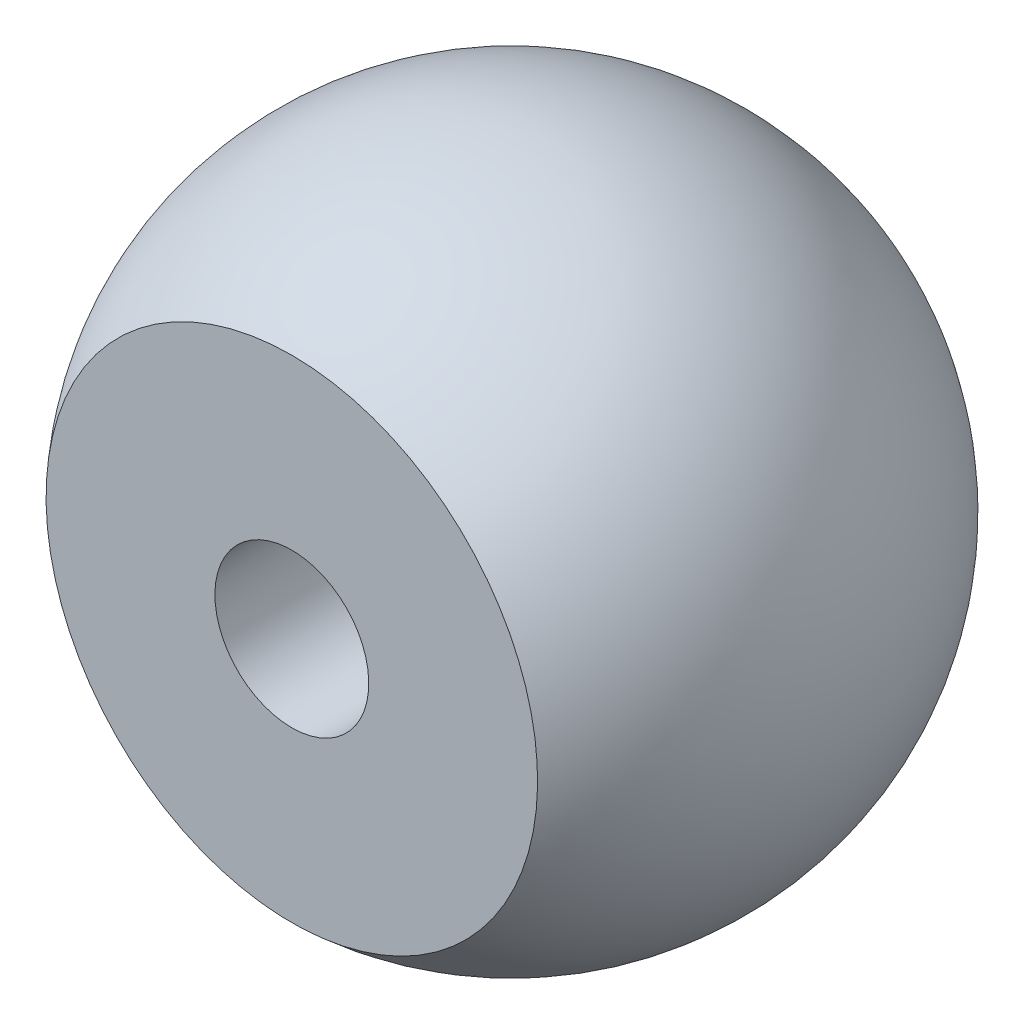
ISO-10303-21;
HEADER;
FILE_DESCRIPTION(('STEP AP214'),'2;1');
FILE_NAME('part.step','',(''),(''),'','','');
FILE_SCHEMA(('AUTOMOTIVE_DESIGN { 1 0 10303 214 1 1 1 1 }'));
ENDSEC;
DATA;
#1=APPLICATION_CONTEXT('core data for automotive mechanical design processes');
#2=APPLICATION_PROTOCOL_DEFINITION('international standard','automotive_design',2000,#1);
#3=PRODUCT_CONTEXT('',#1,'mechanical');
#4=PRODUCT('Part','Part','',(#3));
#5=PRODUCT_RELATED_PRODUCT_CATEGORY('part','',(#4));
#6=PRODUCT_DEFINITION_FORMATION('','',#4);
#7=PRODUCT_DEFINITION_CONTEXT('part definition',#1,'design');
#8=PRODUCT_DEFINITION('design','',#6,#7);
#9=PRODUCT_DEFINITION_SHAPE('','',#8);
#10=(LENGTH_UNIT() NAMED_UNIT(*) SI_UNIT(.MILLI.,.METRE.));
#11=(NAMED_UNIT(*) PLANE_ANGLE_UNIT() SI_UNIT($,.RADIAN.));
#12=(NAMED_UNIT(*) SI_UNIT($,.STERADIAN.) SOLID_ANGLE_UNIT());
#13=UNCERTAINTY_MEASURE_WITH_UNIT(LENGTH_MEASURE(1.E-05),#10,'distance_accuracy_value','');
#14=(GEOMETRIC_REPRESENTATION_CONTEXT(3) GLOBAL_UNCERTAINTY_ASSIGNED_CONTEXT((#13)) GLOBAL_UNIT_ASSIGNED_CONTEXT((#10,
#11,#12)) REPRESENTATION_CONTEXT('',''));
#15=CARTESIAN_POINT('',(0.,0.,0.));
#16=DIRECTION('',(0.,0.,1.));
#17=DIRECTION('',(1.,0.,0.));
#18=AXIS2_PLACEMENT_3D('',#15,#16,#17);
#19=CARTESIAN_POINT('',(0.,0.,0.));
#20=DIRECTION('',(0.,1.,0.));
#21=DIRECTION('',(0.,0.,-1.));
#22=AXIS2_PLACEMENT_3D('',#19,#20,#21);
#23=SPHERICAL_SURFACE('',#22,9.);
#24=CARTESIAN_POINT('',(0.,0.,0.));
#25=DIRECTION('',(0.,0.,-1.));
#26=DIRECTION('',(0.,1.,0.));
#27=AXIS2_PLACEMENT_3D('',#24,#25,#26);
#28=SPHERICAL_SURFACE('',#27,9.);
#29=CARTESIAN_POINT('',(0.,0.,6.));
#30=DIRECTION('',(0.,0.,-1.));
#31=DIRECTION('',(0.,1.,0.));
#32=AXIS2_PLACEMENT_3D('',#29,#30,#31);
#33=CIRCLE('',#32,6.70820393249937);
#34=CARTESIAN_POINT('',(0.,6.70820393249937,6.));
#35=VERTEX_POINT('',#34);
#36=EDGE_CURVE('E11',#35,#35,#33,.F.);
#37=ORIENTED_EDGE('',*,*,#36,.F.);
#38=EDGE_LOOP('',(#37));
#39=FACE_BOUND('',#38,.T.);
#40=ADVANCED_FACE('F45',(#39),#28,.T.);
#41=CARTESIAN_POINT('',(-9.,10.3866107920126,6.));
#42=DIRECTION('',(0.,0.,-1.));
#43=DIRECTION('',(0.,1.,0.));
#44=AXIS2_PLACEMENT_3D('',#41,#42,#43);
#45=PLANE('',#44);
#46=CARTESIAN_POINT('',(0.,0.,6.));
#47=DIRECTION('',(0.,0.,1.));
#48=DIRECTION('',(0.,-1.,0.));
#49=AXIS2_PLACEMENT_3D('',#46,#47,#48);
#50=CIRCLE('',#49,2.09999999999999);
#51=CARTESIAN_POINT('',(0.,-2.09999999999999,6.));
#52=VERTEX_POINT('',#51);
#53=EDGE_CURVE('E65',#52,#52,#50,.T.);
#54=ORIENTED_EDGE('',*,*,#53,.F.);
#55=EDGE_LOOP('',(#54));
#56=FACE_BOUND('',#55,.T.);
#57=ORIENTED_EDGE('',*,*,#36,.T.);
#58=EDGE_LOOP('',(#57));
#59=FACE_BOUND('',#58,.T.);
#60=ADVANCED_FACE('F59',(#56,#59),#45,.F.);
#61=CARTESIAN_POINT('',(0.,0.,-1.));
#62=DIRECTION('',(0.,0.,1.));
#63=DIRECTION('',(0.,-1.,0.));
#64=AXIS2_PLACEMENT_3D('',#61,#62,#63);
#65=CONICAL_SURFACE('',#64,2.1,1.02974425867665);
#66=CARTESIAN_POINT('',(0.,0.,-2.26180729995788));
#67=VERTEX_POINT('',#66);
#68=VERTEX_LOOP('',#67);
#69=FACE_BOUND('',#68,.T.);
#70=CARTESIAN_POINT('',(0.,0.,-1.));
#71=DIRECTION('',(0.,0.,1.));
#72=DIRECTION('',(0.,-1.,0.));
#73=AXIS2_PLACEMENT_3D('',#70,#71,#72);
#74=CIRCLE('',#73,2.1);
#75=CARTESIAN_POINT('',(0.,-2.1,-1.));
#76=VERTEX_POINT('',#75);
#77=EDGE_CURVE('E52',#76,#76,#74,.T.);
#78=ORIENTED_EDGE('',*,*,#77,.T.);
#79=EDGE_LOOP('',(#78));
#80=FACE_BOUND('',#79,.T.);
#81=ADVANCED_FACE('F55',(#69,#80),#65,.F.);
#82=CARTESIAN_POINT('',(0.,0.,6.));
#83=DIRECTION('',(0.,0.,1.));
#84=DIRECTION('',(0.,-1.,0.));
#85=AXIS2_PLACEMENT_3D('',#82,#83,#84);
#86=CYLINDRICAL_SURFACE('',#85,2.09999999999999);
#87=ORIENTED_EDGE('',*,*,#77,.F.);
#88=EDGE_LOOP('',(#87));
#89=FACE_BOUND('',#88,.T.);
#90=ORIENTED_EDGE('',*,*,#53,.T.);
#91=EDGE_LOOP('',(#90));
#92=FACE_BOUND('',#91,.T.);
#93=ADVANCED_FACE('F58',(#89,#92),#86,.F.);
#94=CLOSED_SHELL('',(#40,#60,#81,#93));
#95=MANIFOLD_SOLID_BREP('B2',#94);
#96=ADVANCED_BREP_SHAPE_REPRESENTATION('',(#18,#95),#14);
#97=SHAPE_DEFINITION_REPRESENTATION(#9,#96);
ENDSEC;
END-ISO-10303-21;
